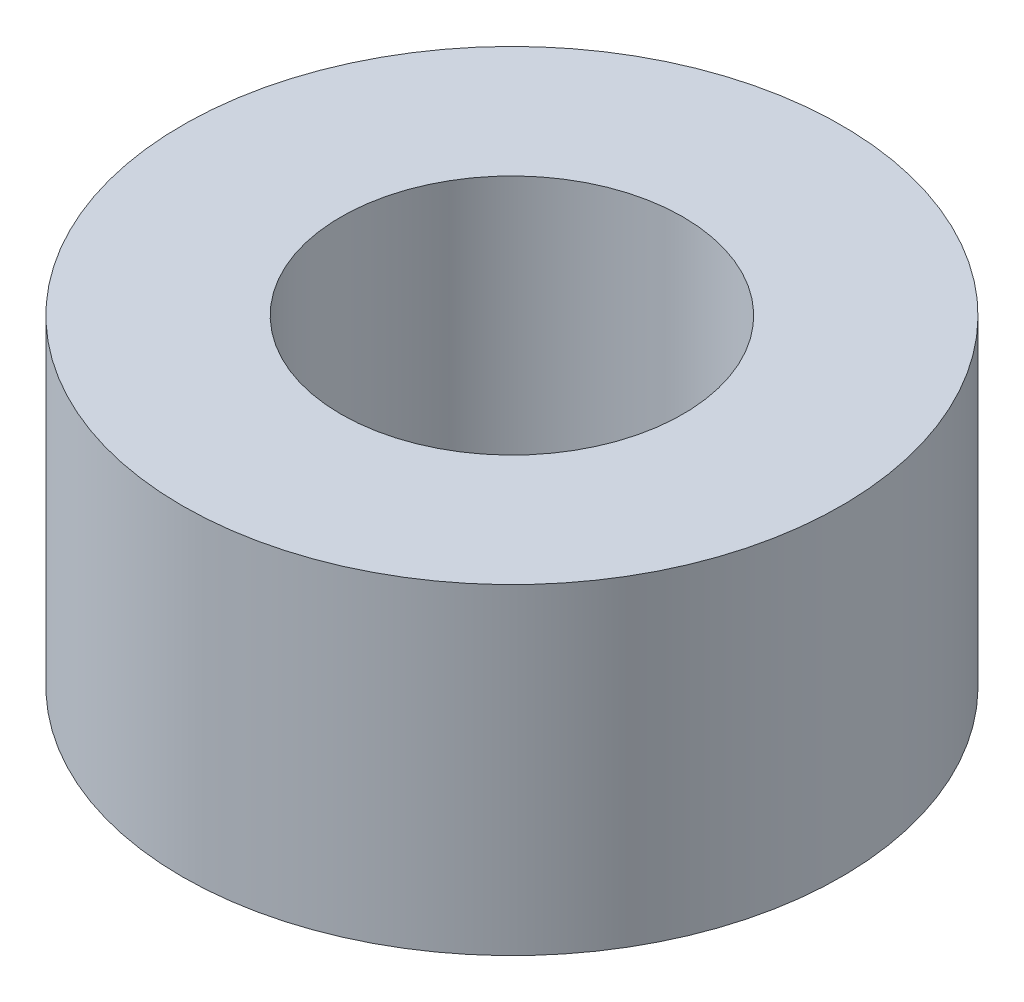
ISO-10303-21;
HEADER;
FILE_DESCRIPTION(('STEP AP214'),'2;1');
FILE_NAME('part.step','',(''),(''),'','','');
FILE_SCHEMA(('AUTOMOTIVE_DESIGN { 1 0 10303 214 1 1 1 1 }'));
ENDSEC;
DATA;
#1=APPLICATION_CONTEXT('core data for automotive mechanical design processes');
#2=APPLICATION_PROTOCOL_DEFINITION('international standard','automotive_design',2000,#1);
#3=PRODUCT_CONTEXT('',#1,'mechanical');
#4=PRODUCT('Part','Part','',(#3));
#5=PRODUCT_RELATED_PRODUCT_CATEGORY('part','',(#4));
#6=PRODUCT_DEFINITION_FORMATION('','',#4);
#7=PRODUCT_DEFINITION_CONTEXT('part definition',#1,'design');
#8=PRODUCT_DEFINITION('design','',#6,#7);
#9=PRODUCT_DEFINITION_SHAPE('','',#8);
#10=(LENGTH_UNIT() NAMED_UNIT(*) SI_UNIT(.MILLI.,.METRE.));
#11=(NAMED_UNIT(*) PLANE_ANGLE_UNIT() SI_UNIT($,.RADIAN.));
#12=(NAMED_UNIT(*) SI_UNIT($,.STERADIAN.) SOLID_ANGLE_UNIT());
#13=UNCERTAINTY_MEASURE_WITH_UNIT(LENGTH_MEASURE(1.E-05),#10,'distance_accuracy_value','');
#14=(GEOMETRIC_REPRESENTATION_CONTEXT(3) GLOBAL_UNCERTAINTY_ASSIGNED_CONTEXT((#13)) GLOBAL_UNIT_ASSIGNED_CONTEXT((#10,
#11,#12)) REPRESENTATION_CONTEXT('',''));
#15=CARTESIAN_POINT('',(0.,0.,0.));
#16=DIRECTION('',(0.,0.,1.));
#17=DIRECTION('',(1.,0.,0.));
#18=AXIS2_PLACEMENT_3D('',#15,#16,#17);
#19=CARTESIAN_POINT('',(0.,3.9,0.));
#20=DIRECTION('',(0.,-1.,0.));
#21=DIRECTION('',(0.,0.,-1.));
#22=AXIS2_PLACEMENT_3D('',#19,#20,#21);
#23=CYLINDRICAL_SURFACE('',#22,4.);
#24=CARTESIAN_POINT('',(0.,3.9,0.));
#25=DIRECTION('',(0.,1.,0.));
#26=DIRECTION('',(0.,0.,1.));
#27=AXIS2_PLACEMENT_3D('',#24,#25,#26);
#28=CIRCLE('',#27,4.);
#29=CARTESIAN_POINT('',(0.,3.9,4.));
#30=VERTEX_POINT('',#29);
#31=EDGE_CURVE('E10',#30,#30,#28,.T.);
#32=ORIENTED_EDGE('',*,*,#31,.F.);
#33=EDGE_LOOP('',(#32));
#34=FACE_BOUND('',#33,.T.);
#35=CARTESIAN_POINT('',(0.,0.,0.));
#36=DIRECTION('',(0.,1.,0.));
#37=DIRECTION('',(0.,0.,1.));
#38=AXIS2_PLACEMENT_3D('',#35,#36,#37);
#39=CIRCLE('',#38,4.);
#40=CARTESIAN_POINT('',(0.,0.,4.));
#41=VERTEX_POINT('',#40);
#42=EDGE_CURVE('E34',#41,#41,#39,.T.);
#43=ORIENTED_EDGE('',*,*,#42,.T.);
#44=EDGE_LOOP('',(#43));
#45=FACE_BOUND('',#44,.T.);
#46=ADVANCED_FACE('F31',(#34,#45),#23,.T.);
#47=CARTESIAN_POINT('',(0.,3.9,0.));
#48=DIRECTION('',(0.,1.,0.));
#49=DIRECTION('',(0.,0.,1.));
#50=AXIS2_PLACEMENT_3D('',#47,#48,#49);
#51=PLANE('',#50);
#52=CARTESIAN_POINT('',(0.,3.9,0.));
#53=DIRECTION('',(0.,-1.,0.));
#54=DIRECTION('',(0.,0.,-1.));
#55=AXIS2_PLACEMENT_3D('',#52,#53,#54);
#56=CIRCLE('',#55,2.075);
#57=CARTESIAN_POINT('',(0.,3.9,-2.075));
#58=VERTEX_POINT('',#57);
#59=EDGE_CURVE('E41',#58,#58,#56,.T.);
#60=ORIENTED_EDGE('',*,*,#59,.T.);
#61=EDGE_LOOP('',(#60));
#62=FACE_BOUND('',#61,.T.);
#63=ORIENTED_EDGE('',*,*,#31,.T.);
#64=EDGE_LOOP('',(#63));
#65=FACE_BOUND('',#64,.T.);
#66=ADVANCED_FACE('F49',(#62,#65),#51,.T.);
#67=CARTESIAN_POINT('',(0.,0.,0.));
#68=DIRECTION('',(0.,1.,0.));
#69=DIRECTION('',(0.,0.,1.));
#70=AXIS2_PLACEMENT_3D('',#67,#68,#69);
#71=PLANE('',#70);
#72=CARTESIAN_POINT('',(0.,0.,0.));
#73=DIRECTION('',(0.,-1.,0.));
#74=DIRECTION('',(0.,0.,-1.));
#75=AXIS2_PLACEMENT_3D('',#72,#73,#74);
#76=CIRCLE('',#75,2.075);
#77=CARTESIAN_POINT('',(0.,0.,-2.075));
#78=VERTEX_POINT('',#77);
#79=EDGE_CURVE('E43',#78,#78,#76,.T.);
#80=ORIENTED_EDGE('',*,*,#79,.F.);
#81=EDGE_LOOP('',(#80));
#82=FACE_BOUND('',#81,.T.);
#83=ORIENTED_EDGE('',*,*,#42,.F.);
#84=EDGE_LOOP('',(#83));
#85=FACE_BOUND('',#84,.T.);
#86=ADVANCED_FACE('F54',(#82,#85),#71,.F.);
#87=CARTESIAN_POINT('',(0.,3.9,0.));
#88=DIRECTION('',(0.,-1.,0.));
#89=DIRECTION('',(0.,0.,-1.));
#90=AXIS2_PLACEMENT_3D('',#87,#88,#89);
#91=CYLINDRICAL_SURFACE('',#90,2.075);
#92=ORIENTED_EDGE('',*,*,#59,.F.);
#93=EDGE_LOOP('',(#92));
#94=FACE_BOUND('',#93,.T.);
#95=ORIENTED_EDGE('',*,*,#79,.T.);
#96=EDGE_LOOP('',(#95));
#97=FACE_BOUND('',#96,.T.);
#98=ADVANCED_FACE('F51',(#94,#97),#91,.F.);
#99=CLOSED_SHELL('',(#46,#66,#86,#98));
#100=MANIFOLD_SOLID_BREP('B2',#99);
#101=ADVANCED_BREP_SHAPE_REPRESENTATION('',(#18,#100),#14);
#102=SHAPE_DEFINITION_REPRESENTATION(#9,#101);
ENDSEC;
END-ISO-10303-21;
